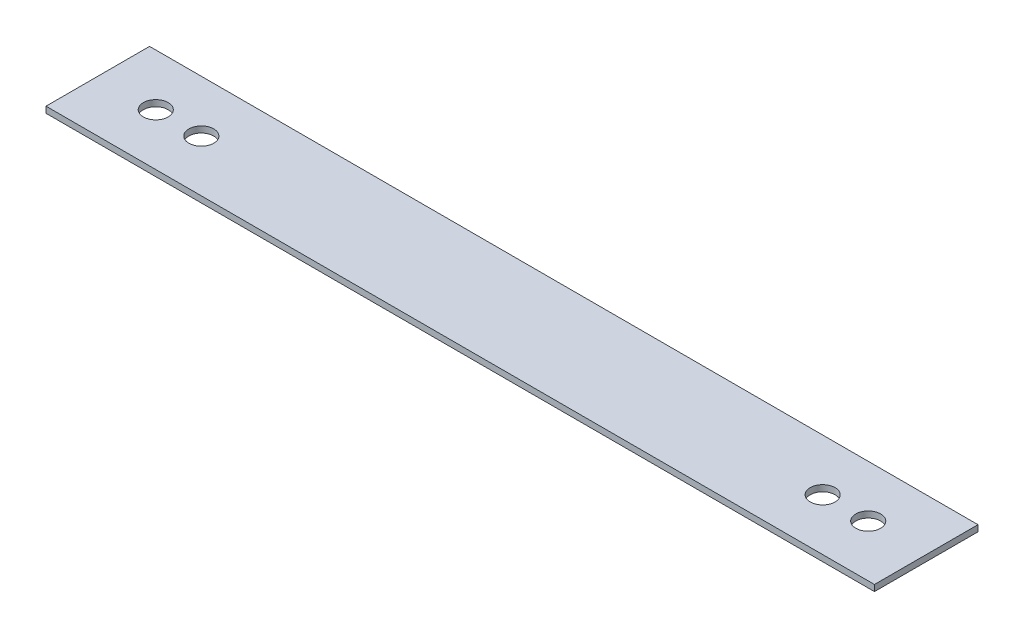
ISO-10303-21;
HEADER;
FILE_DESCRIPTION(('STEP AP214'),'2;1');
FILE_NAME('part.step','',(''),(''),'','','');
FILE_SCHEMA(('AUTOMOTIVE_DESIGN { 1 0 10303 214 1 1 1 1 }'));
ENDSEC;
DATA;
#1=APPLICATION_CONTEXT('core data for automotive mechanical design processes');
#2=APPLICATION_PROTOCOL_DEFINITION('international standard','automotive_design',2000,#1);
#3=PRODUCT_CONTEXT('',#1,'mechanical');
#4=PRODUCT('Part','Part','',(#3));
#5=PRODUCT_RELATED_PRODUCT_CATEGORY('part','',(#4));
#6=PRODUCT_DEFINITION_FORMATION('','',#4);
#7=PRODUCT_DEFINITION_CONTEXT('part definition',#1,'design');
#8=PRODUCT_DEFINITION('design','',#6,#7);
#9=PRODUCT_DEFINITION_SHAPE('','',#8);
#10=(LENGTH_UNIT() NAMED_UNIT(*) SI_UNIT(.MILLI.,.METRE.));
#11=(NAMED_UNIT(*) PLANE_ANGLE_UNIT() SI_UNIT($,.RADIAN.));
#12=(NAMED_UNIT(*) SI_UNIT($,.STERADIAN.) SOLID_ANGLE_UNIT());
#13=UNCERTAINTY_MEASURE_WITH_UNIT(LENGTH_MEASURE(1.E-05),#10,'distance_accuracy_value','');
#14=(GEOMETRIC_REPRESENTATION_CONTEXT(3) GLOBAL_UNCERTAINTY_ASSIGNED_CONTEXT((#13)) GLOBAL_UNIT_ASSIGNED_CONTEXT((#10,
#11,#12)) REPRESENTATION_CONTEXT('',''));
#15=CARTESIAN_POINT('',(0.,0.,0.));
#16=DIRECTION('',(0.,0.,1.));
#17=DIRECTION('',(1.,0.,0.));
#18=AXIS2_PLACEMENT_3D('',#15,#16,#17);
#19=CARTESIAN_POINT('',(-200.,3.,-25.));
#20=DIRECTION('',(1.,0.,0.));
#21=DIRECTION('',(0.,0.,-1.));
#22=AXIS2_PLACEMENT_3D('',#19,#20,#21);
#23=PLANE('',#22);
#24=DIRECTION('',(0.,0.,1.));
#25=VECTOR('',#24,1.);
#26=CARTESIAN_POINT('',(-200.,0.,-25.));
#27=LINE('',#26,#25);
#28=CARTESIAN_POINT('',(-200.,0.,-25.));
#29=VERTEX_POINT('',#28);
#30=CARTESIAN_POINT('',(-200.,0.,25.));
#31=VERTEX_POINT('',#30);
#32=EDGE_CURVE('E100',#29,#31,#27,.T.);
#33=ORIENTED_EDGE('',*,*,#32,.T.);
#34=DIRECTION('',(0.,-1.,0.));
#35=VECTOR('',#34,1.);
#36=CARTESIAN_POINT('',(-200.,3.,25.));
#37=LINE('',#36,#35);
#38=CARTESIAN_POINT('',(-200.,3.,25.));
#39=VERTEX_POINT('',#38);
#40=EDGE_CURVE('E11',#39,#31,#37,.T.);
#41=ORIENTED_EDGE('',*,*,#40,.F.);
#42=DIRECTION('',(0.,0.,1.));
#43=VECTOR('',#42,1.);
#44=CARTESIAN_POINT('',(-200.,3.,-25.));
#45=LINE('',#44,#43);
#46=CARTESIAN_POINT('',(-200.,3.,-25.));
#47=VERTEX_POINT('',#46);
#48=EDGE_CURVE('E87',#47,#39,#45,.T.);
#49=ORIENTED_EDGE('',*,*,#48,.F.);
#50=DIRECTION('',(0.,-1.,0.));
#51=VECTOR('',#50,1.);
#52=CARTESIAN_POINT('',(-200.,3.,-25.));
#53=LINE('',#52,#51);
#54=EDGE_CURVE('E96',#47,#29,#53,.T.);
#55=ORIENTED_EDGE('',*,*,#54,.T.);
#56=EDGE_LOOP('',(#33,#41,#49,#55));
#57=FACE_BOUND('',#56,.T.);
#58=ADVANCED_FACE('F34',(#57),#23,.F.);
#59=CARTESIAN_POINT('',(200.,3.,25.));
#60=DIRECTION('',(0.,0.,-1.));
#61=DIRECTION('',(-1.,0.,0.));
#62=AXIS2_PLACEMENT_3D('',#59,#60,#61);
#63=PLANE('',#62);
#64=DIRECTION('',(1.,0.,0.));
#65=VECTOR('',#64,1.);
#66=CARTESIAN_POINT('',(200.,0.,25.));
#67=LINE('',#66,#65);
#68=CARTESIAN_POINT('',(200.,0.,25.));
#69=VERTEX_POINT('',#68);
#70=EDGE_CURVE('E91',#31,#69,#67,.T.);
#71=ORIENTED_EDGE('',*,*,#70,.T.);
#72=DIRECTION('',(0.,-1.,0.));
#73=VECTOR('',#72,1.);
#74=CARTESIAN_POINT('',(200.,3.,25.));
#75=LINE('',#74,#73);
#76=CARTESIAN_POINT('',(200.,3.,25.));
#77=VERTEX_POINT('',#76);
#78=EDGE_CURVE('E43',#77,#69,#75,.T.);
#79=ORIENTED_EDGE('',*,*,#78,.F.);
#80=DIRECTION('',(1.,0.,0.));
#81=VECTOR('',#80,1.);
#82=CARTESIAN_POINT('',(200.,3.,25.));
#83=LINE('',#82,#81);
#84=EDGE_CURVE('E82',#39,#77,#83,.T.);
#85=ORIENTED_EDGE('',*,*,#84,.F.);
#86=ORIENTED_EDGE('',*,*,#40,.T.);
#87=EDGE_LOOP('',(#71,#79,#85,#86));
#88=FACE_BOUND('',#87,.T.);
#89=ADVANCED_FACE('F90',(#88),#63,.F.);
#90=CARTESIAN_POINT('',(200.,3.,-25.));
#91=DIRECTION('',(-1.,0.,0.));
#92=DIRECTION('',(0.,0.,1.));
#93=AXIS2_PLACEMENT_3D('',#90,#91,#92);
#94=PLANE('',#93);
#95=DIRECTION('',(0.,0.,-1.));
#96=VECTOR('',#95,1.);
#97=CARTESIAN_POINT('',(200.,0.,-25.));
#98=LINE('',#97,#96);
#99=CARTESIAN_POINT('',(200.,0.,-25.));
#100=VERTEX_POINT('',#99);
#101=EDGE_CURVE('E69',#69,#100,#98,.T.);
#102=ORIENTED_EDGE('',*,*,#101,.T.);
#103=DIRECTION('',(0.,-1.,0.));
#104=VECTOR('',#103,1.);
#105=CARTESIAN_POINT('',(200.,3.,-25.));
#106=LINE('',#105,#104);
#107=CARTESIAN_POINT('',(200.,3.,-25.));
#108=VERTEX_POINT('',#107);
#109=EDGE_CURVE('E92',#108,#100,#106,.T.);
#110=ORIENTED_EDGE('',*,*,#109,.F.);
#111=DIRECTION('',(0.,0.,-1.));
#112=VECTOR('',#111,1.);
#113=CARTESIAN_POINT('',(200.,3.,-25.));
#114=LINE('',#113,#112);
#115=EDGE_CURVE('E85',#77,#108,#114,.T.);
#116=ORIENTED_EDGE('',*,*,#115,.F.);
#117=ORIENTED_EDGE('',*,*,#78,.T.);
#118=EDGE_LOOP('',(#102,#110,#116,#117));
#119=FACE_BOUND('',#118,.T.);
#120=ADVANCED_FACE('F94',(#119),#94,.F.);
#121=CARTESIAN_POINT('',(200.,3.,-25.));
#122=DIRECTION('',(0.,0.,1.));
#123=DIRECTION('',(1.,0.,0.));
#124=AXIS2_PLACEMENT_3D('',#121,#122,#123);
#125=PLANE('',#124);
#126=DIRECTION('',(-1.,0.,0.));
#127=VECTOR('',#126,1.);
#128=CARTESIAN_POINT('',(200.,0.,-25.));
#129=LINE('',#128,#127);
#130=EDGE_CURVE('E75',#100,#29,#129,.T.);
#131=ORIENTED_EDGE('',*,*,#130,.T.);
#132=ORIENTED_EDGE('',*,*,#54,.F.);
#133=DIRECTION('',(-1.,0.,0.));
#134=VECTOR('',#133,1.);
#135=CARTESIAN_POINT('',(200.,3.,-25.));
#136=LINE('',#135,#134);
#137=EDGE_CURVE('E52',#108,#47,#136,.T.);
#138=ORIENTED_EDGE('',*,*,#137,.F.);
#139=ORIENTED_EDGE('',*,*,#109,.T.);
#140=EDGE_LOOP('',(#131,#132,#138,#139));
#141=FACE_BOUND('',#140,.T.);
#142=ADVANCED_FACE('F137',(#141),#125,.F.);
#143=CARTESIAN_POINT('',(0.,3.,0.));
#144=DIRECTION('',(0.,-1.,0.));
#145=DIRECTION('',(0.,0.,-1.));
#146=AXIS2_PLACEMENT_3D('',#143,#144,#145);
#147=PLANE('',#146);
#148=CARTESIAN_POINT('',(172.,3.,0.));
#149=DIRECTION('',(0.,1.,0.));
#150=DIRECTION('',(0.,0.,1.));
#151=AXIS2_PLACEMENT_3D('',#148,#149,#150);
#152=CIRCLE('',#151,6.00000000000002);
#153=CARTESIAN_POINT('',(172.,3.,6.00000000000002));
#154=VERTEX_POINT('',#153);
#155=EDGE_CURVE('E127',#154,#154,#152,.T.);
#156=ORIENTED_EDGE('',*,*,#155,.F.);
#157=EDGE_LOOP('',(#156));
#158=FACE_BOUND('',#157,.T.);
#159=CARTESIAN_POINT('',(150.,3.,0.));
#160=DIRECTION('',(0.,1.,0.));
#161=DIRECTION('',(0.,0.,1.));
#162=AXIS2_PLACEMENT_3D('',#159,#160,#161);
#163=CIRCLE('',#162,6.00000000000002);
#164=CARTESIAN_POINT('',(150.,3.,6.00000000000002));
#165=VERTEX_POINT('',#164);
#166=EDGE_CURVE('E117',#165,#165,#163,.T.);
#167=ORIENTED_EDGE('',*,*,#166,.F.);
#168=EDGE_LOOP('',(#167));
#169=FACE_BOUND('',#168,.T.);
#170=CARTESIAN_POINT('',(-150.,3.,0.));
#171=DIRECTION('',(0.,1.,0.));
#172=DIRECTION('',(0.,0.,1.));
#173=AXIS2_PLACEMENT_3D('',#170,#171,#172);
#174=CIRCLE('',#173,6.00000000000002);
#175=CARTESIAN_POINT('',(-150.,3.,6.00000000000002));
#176=VERTEX_POINT('',#175);
#177=EDGE_CURVE('E114',#176,#176,#174,.T.);
#178=ORIENTED_EDGE('',*,*,#177,.F.);
#179=EDGE_LOOP('',(#178));
#180=FACE_BOUND('',#179,.T.);
#181=CARTESIAN_POINT('',(-172.,3.,0.));
#182=DIRECTION('',(0.,1.,0.));
#183=DIRECTION('',(0.,0.,1.));
#184=AXIS2_PLACEMENT_3D('',#181,#182,#183);
#185=CIRCLE('',#184,6.00000000000002);
#186=CARTESIAN_POINT('',(-172.,3.,6.00000000000002));
#187=VERTEX_POINT('',#186);
#188=EDGE_CURVE('E111',#187,#187,#185,.T.);
#189=ORIENTED_EDGE('',*,*,#188,.F.);
#190=EDGE_LOOP('',(#189));
#191=FACE_BOUND('',#190,.T.);
#192=ORIENTED_EDGE('',*,*,#48,.T.);
#193=ORIENTED_EDGE('',*,*,#84,.T.);
#194=ORIENTED_EDGE('',*,*,#115,.T.);
#195=ORIENTED_EDGE('',*,*,#137,.T.);
#196=EDGE_LOOP('',(#192,#193,#194,#195));
#197=FACE_BOUND('',#196,.T.);
#198=ADVANCED_FACE('F83',(#158,#169,#180,#191,#197),#147,.F.);
#199=CARTESIAN_POINT('',(0.,0.,0.));
#200=DIRECTION('',(0.,-1.,0.));
#201=DIRECTION('',(0.,0.,-1.));
#202=AXIS2_PLACEMENT_3D('',#199,#200,#201);
#203=PLANE('',#202);
#204=CARTESIAN_POINT('',(172.,0.,0.));
#205=DIRECTION('',(0.,-1.,0.));
#206=DIRECTION('',(0.,0.,-1.));
#207=AXIS2_PLACEMENT_3D('',#204,#205,#206);
#208=CIRCLE('',#207,6.00000000000002);
#209=CARTESIAN_POINT('',(172.,0.,-6.00000000000002));
#210=VERTEX_POINT('',#209);
#211=EDGE_CURVE('E37',#210,#210,#208,.T.);
#212=ORIENTED_EDGE('',*,*,#211,.F.);
#213=EDGE_LOOP('',(#212));
#214=FACE_BOUND('',#213,.T.);
#215=CARTESIAN_POINT('',(150.,0.,0.));
#216=DIRECTION('',(0.,-1.,0.));
#217=DIRECTION('',(0.,0.,-1.));
#218=AXIS2_PLACEMENT_3D('',#215,#216,#217);
#219=CIRCLE('',#218,6.00000000000002);
#220=CARTESIAN_POINT('',(150.,0.,-6.00000000000002));
#221=VERTEX_POINT('',#220);
#222=EDGE_CURVE('E115',#221,#221,#219,.T.);
#223=ORIENTED_EDGE('',*,*,#222,.F.);
#224=EDGE_LOOP('',(#223));
#225=FACE_BOUND('',#224,.T.);
#226=CARTESIAN_POINT('',(-150.,0.,0.));
#227=DIRECTION('',(0.,-1.,0.));
#228=DIRECTION('',(0.,0.,-1.));
#229=AXIS2_PLACEMENT_3D('',#226,#227,#228);
#230=CIRCLE('',#229,6.00000000000002);
#231=CARTESIAN_POINT('',(-150.,0.,-6.00000000000002));
#232=VERTEX_POINT('',#231);
#233=EDGE_CURVE('E112',#232,#232,#230,.T.);
#234=ORIENTED_EDGE('',*,*,#233,.F.);
#235=EDGE_LOOP('',(#234));
#236=FACE_BOUND('',#235,.T.);
#237=CARTESIAN_POINT('',(-172.,0.,0.));
#238=DIRECTION('',(0.,-1.,0.));
#239=DIRECTION('',(0.,0.,-1.));
#240=AXIS2_PLACEMENT_3D('',#237,#238,#239);
#241=CIRCLE('',#240,6.00000000000002);
#242=CARTESIAN_POINT('',(-172.,0.,-6.00000000000002));
#243=VERTEX_POINT('',#242);
#244=EDGE_CURVE('E103',#243,#243,#241,.T.);
#245=ORIENTED_EDGE('',*,*,#244,.F.);
#246=EDGE_LOOP('',(#245));
#247=FACE_BOUND('',#246,.T.);
#248=ORIENTED_EDGE('',*,*,#32,.F.);
#249=ORIENTED_EDGE('',*,*,#130,.F.);
#250=ORIENTED_EDGE('',*,*,#101,.F.);
#251=ORIENTED_EDGE('',*,*,#70,.F.);
#252=EDGE_LOOP('',(#248,#249,#250,#251));
#253=FACE_BOUND('',#252,.T.);
#254=ADVANCED_FACE('F136',(#214,#225,#236,#247,#253),#203,.T.);
#255=CARTESIAN_POINT('',(-172.,-5.,0.));
#256=DIRECTION('',(0.,1.,0.));
#257=DIRECTION('',(0.,0.,1.));
#258=AXIS2_PLACEMENT_3D('',#255,#256,#257);
#259=CYLINDRICAL_SURFACE('',#258,6.00000000000002);
#260=ORIENTED_EDGE('',*,*,#244,.T.);
#261=EDGE_LOOP('',(#260));
#262=FACE_BOUND('',#261,.T.);
#263=ORIENTED_EDGE('',*,*,#188,.T.);
#264=EDGE_LOOP('',(#263));
#265=FACE_BOUND('',#264,.T.);
#266=ADVANCED_FACE('F133',(#262,#265),#259,.F.);
#267=CARTESIAN_POINT('',(-150.,-5.,0.));
#268=DIRECTION('',(0.,1.,0.));
#269=DIRECTION('',(0.,0.,1.));
#270=AXIS2_PLACEMENT_3D('',#267,#268,#269);
#271=CYLINDRICAL_SURFACE('',#270,6.00000000000002);
#272=ORIENTED_EDGE('',*,*,#233,.T.);
#273=EDGE_LOOP('',(#272));
#274=FACE_BOUND('',#273,.T.);
#275=ORIENTED_EDGE('',*,*,#177,.T.);
#276=EDGE_LOOP('',(#275));
#277=FACE_BOUND('',#276,.T.);
#278=ADVANCED_FACE('F186',(#274,#277),#271,.F.);
#279=CARTESIAN_POINT('',(150.,-5.,0.));
#280=DIRECTION('',(0.,1.,0.));
#281=DIRECTION('',(0.,0.,1.));
#282=AXIS2_PLACEMENT_3D('',#279,#280,#281);
#283=CYLINDRICAL_SURFACE('',#282,6.00000000000002);
#284=ORIENTED_EDGE('',*,*,#222,.T.);
#285=EDGE_LOOP('',(#284));
#286=FACE_BOUND('',#285,.T.);
#287=ORIENTED_EDGE('',*,*,#166,.T.);
#288=EDGE_LOOP('',(#287));
#289=FACE_BOUND('',#288,.T.);
#290=ADVANCED_FACE('F195',(#286,#289),#283,.F.);
#291=CARTESIAN_POINT('',(172.,-5.,0.));
#292=DIRECTION('',(0.,1.,0.));
#293=DIRECTION('',(0.,0.,1.));
#294=AXIS2_PLACEMENT_3D('',#291,#292,#293);
#295=CYLINDRICAL_SURFACE('',#294,6.00000000000002);
#296=ORIENTED_EDGE('',*,*,#211,.T.);
#297=EDGE_LOOP('',(#296));
#298=FACE_BOUND('',#297,.T.);
#299=ORIENTED_EDGE('',*,*,#155,.T.);
#300=EDGE_LOOP('',(#299));
#301=FACE_BOUND('',#300,.T.);
#302=ADVANCED_FACE('F205',(#298,#301),#295,.F.);
#303=CLOSED_SHELL('',(#58,#89,#120,#142,#198,#254,#266,#278,#290,#302));
#304=MANIFOLD_SOLID_BREP('B2',#303);
#305=ADVANCED_BREP_SHAPE_REPRESENTATION('',(#18,#304),#14);
#306=SHAPE_DEFINITION_REPRESENTATION(#9,#305);
ENDSEC;
END-ISO-10303-21;
